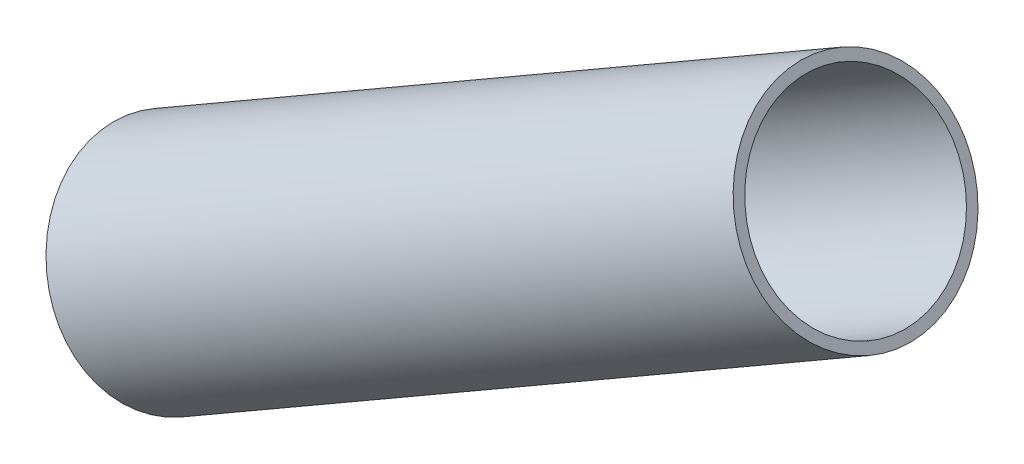
ISO-10303-21;
HEADER;
FILE_DESCRIPTION(('STEP AP214'),'2;1');
FILE_NAME('part.step','',(''),(''),'','','');
FILE_SCHEMA(('AUTOMOTIVE_DESIGN { 1 0 10303 214 1 1 1 1 }'));
ENDSEC;
DATA;
#1=APPLICATION_CONTEXT('core data for automotive mechanical design processes');
#2=APPLICATION_PROTOCOL_DEFINITION('international standard','automotive_design',2000,#1);
#3=PRODUCT_CONTEXT('',#1,'mechanical');
#4=PRODUCT('Part','Part','',(#3));
#5=PRODUCT_RELATED_PRODUCT_CATEGORY('part','',(#4));
#6=PRODUCT_DEFINITION_FORMATION('','',#4);
#7=PRODUCT_DEFINITION_CONTEXT('part definition',#1,'design');
#8=PRODUCT_DEFINITION('design','',#6,#7);
#9=PRODUCT_DEFINITION_SHAPE('','',#8);
#10=(LENGTH_UNIT() NAMED_UNIT(*) SI_UNIT(.MILLI.,.METRE.));
#11=(NAMED_UNIT(*) PLANE_ANGLE_UNIT() SI_UNIT($,.RADIAN.));
#12=(NAMED_UNIT(*) SI_UNIT($,.STERADIAN.) SOLID_ANGLE_UNIT());
#13=UNCERTAINTY_MEASURE_WITH_UNIT(LENGTH_MEASURE(1.E-05),#10,'distance_accuracy_value','');
#14=(GEOMETRIC_REPRESENTATION_CONTEXT(3) GLOBAL_UNCERTAINTY_ASSIGNED_CONTEXT((#13)) GLOBAL_UNIT_ASSIGNED_CONTEXT((#10,
#11,#12)) REPRESENTATION_CONTEXT('',''));
#15=CARTESIAN_POINT('',(0.,0.,0.));
#16=DIRECTION('',(0.,0.,1.));
#17=DIRECTION('',(1.,0.,0.));
#18=AXIS2_PLACEMENT_3D('',#15,#16,#17);
#19=CARTESIAN_POINT('',(-527.929086146993,-304.800000000001,0.));
#20=DIRECTION('',(0.866025403784438,0.500000000000001,0.));
#21=DIRECTION('',(-0.500000000000001,0.866025403784438,0.));
#22=AXIS2_PLACEMENT_3D('',#19,#20,#21);
#23=CYLINDRICAL_SURFACE('',#22,76.2);
#24=CARTESIAN_POINT('',(-527.929086146993,-304.800000000001,0.));
#25=DIRECTION('',(-0.866025403784438,-0.500000000000001,0.));
#26=DIRECTION('',(0.500000000000001,-0.866025403784438,0.));
#27=AXIS2_PLACEMENT_3D('',#24,#25,#26);
#28=CIRCLE('',#27,76.2);
#29=CARTESIAN_POINT('',(-489.829086146993,-370.791135768375,0.));
#30=VERTEX_POINT('',#29);
#31=EDGE_CURVE('E37',#30,#30,#28,.T.);
#32=ORIENTED_EDGE('',*,*,#31,.T.);
#33=EDGE_LOOP('',(#32));
#34=FACE_BOUND('',#33,.T.);
#35=CARTESIAN_POINT('',(0.,0.,0.));
#36=DIRECTION('',(-0.866025403784438,-0.500000000000001,0.));
#37=DIRECTION('',(0.500000000000001,-0.866025403784438,0.));
#38=AXIS2_PLACEMENT_3D('',#35,#36,#37);
#39=CIRCLE('',#38,76.2);
#40=CARTESIAN_POINT('',(38.1000000000001,-65.9911357683742,0.));
#41=VERTEX_POINT('',#40);
#42=EDGE_CURVE('E45',#41,#41,#39,.T.);
#43=ORIENTED_EDGE('',*,*,#42,.F.);
#44=EDGE_LOOP('',(#43));
#45=FACE_BOUND('',#44,.T.);
#46=ADVANCED_FACE('F31',(#34,#45),#23,.F.);
#47=CARTESIAN_POINT('',(-527.929086146993,-304.800000000001,0.));
#48=DIRECTION('',(0.866025403784438,0.500000000000001,0.));
#49=DIRECTION('',(-0.500000000000001,0.866025403784438,0.));
#50=AXIS2_PLACEMENT_3D('',#47,#48,#49);
#51=CYLINDRICAL_SURFACE('',#50,84.1375);
#52=CARTESIAN_POINT('',(-527.929086146993,-304.800000000001,0.));
#53=DIRECTION('',(-0.866025403784438,-0.500000000000001,0.));
#54=DIRECTION('',(0.500000000000001,-0.866025403784438,0.));
#55=AXIS2_PLACEMENT_3D('',#52,#53,#54);
#56=CIRCLE('',#55,84.1375);
#57=CARTESIAN_POINT('',(-485.860336146993,-377.665212410914,0.));
#58=VERTEX_POINT('',#57);
#59=EDGE_CURVE('E10',#58,#58,#56,.T.);
#60=ORIENTED_EDGE('',*,*,#59,.F.);
#61=EDGE_LOOP('',(#60));
#62=FACE_BOUND('',#61,.T.);
#63=CARTESIAN_POINT('',(0.,0.,0.));
#64=DIRECTION('',(-0.866025403784438,-0.500000000000001,0.));
#65=DIRECTION('',(0.500000000000001,-0.866025403784438,0.));
#66=AXIS2_PLACEMENT_3D('',#63,#64,#65);
#67=CIRCLE('',#66,84.1375);
#68=CARTESIAN_POINT('',(42.0687500000001,-72.8652124109131,0.));
#69=VERTEX_POINT('',#68);
#70=EDGE_CURVE('E41',#69,#69,#67,.T.);
#71=ORIENTED_EDGE('',*,*,#70,.T.);
#72=EDGE_LOOP('',(#71));
#73=FACE_BOUND('',#72,.T.);
#74=ADVANCED_FACE('F55',(#62,#73),#51,.T.);
#75=CARTESIAN_POINT('',(-527.929086146993,-304.800000000001,0.));
#76=DIRECTION('',(-0.866025403784438,-0.500000000000001,0.));
#77=DIRECTION('',(0.500000000000001,-0.866025403784438,0.));
#78=AXIS2_PLACEMENT_3D('',#75,#76,#77);
#79=PLANE('',#78);
#80=ORIENTED_EDGE('',*,*,#31,.F.);
#81=EDGE_LOOP('',(#80));
#82=FACE_BOUND('',#81,.T.);
#83=ORIENTED_EDGE('',*,*,#59,.T.);
#84=EDGE_LOOP('',(#83));
#85=FACE_BOUND('',#84,.T.);
#86=ADVANCED_FACE('F58',(#82,#85),#79,.T.);
#87=CARTESIAN_POINT('',(0.,0.,0.));
#88=DIRECTION('',(-0.866025403784438,-0.500000000000001,0.));
#89=DIRECTION('',(0.500000000000001,-0.866025403784438,0.));
#90=AXIS2_PLACEMENT_3D('',#87,#88,#89);
#91=PLANE('',#90);
#92=ORIENTED_EDGE('',*,*,#42,.T.);
#93=EDGE_LOOP('',(#92));
#94=FACE_BOUND('',#93,.T.);
#95=ORIENTED_EDGE('',*,*,#70,.F.);
#96=EDGE_LOOP('',(#95));
#97=FACE_BOUND('',#96,.T.);
#98=ADVANCED_FACE('F51',(#94,#97),#91,.F.);
#99=CLOSED_SHELL('',(#46,#74,#86,#98));
#100=MANIFOLD_SOLID_BREP('B2',#99);
#101=ADVANCED_BREP_SHAPE_REPRESENTATION('',(#18,#100),#14);
#102=SHAPE_DEFINITION_REPRESENTATION(#9,#101);
ENDSEC;
END-ISO-10303-21;
